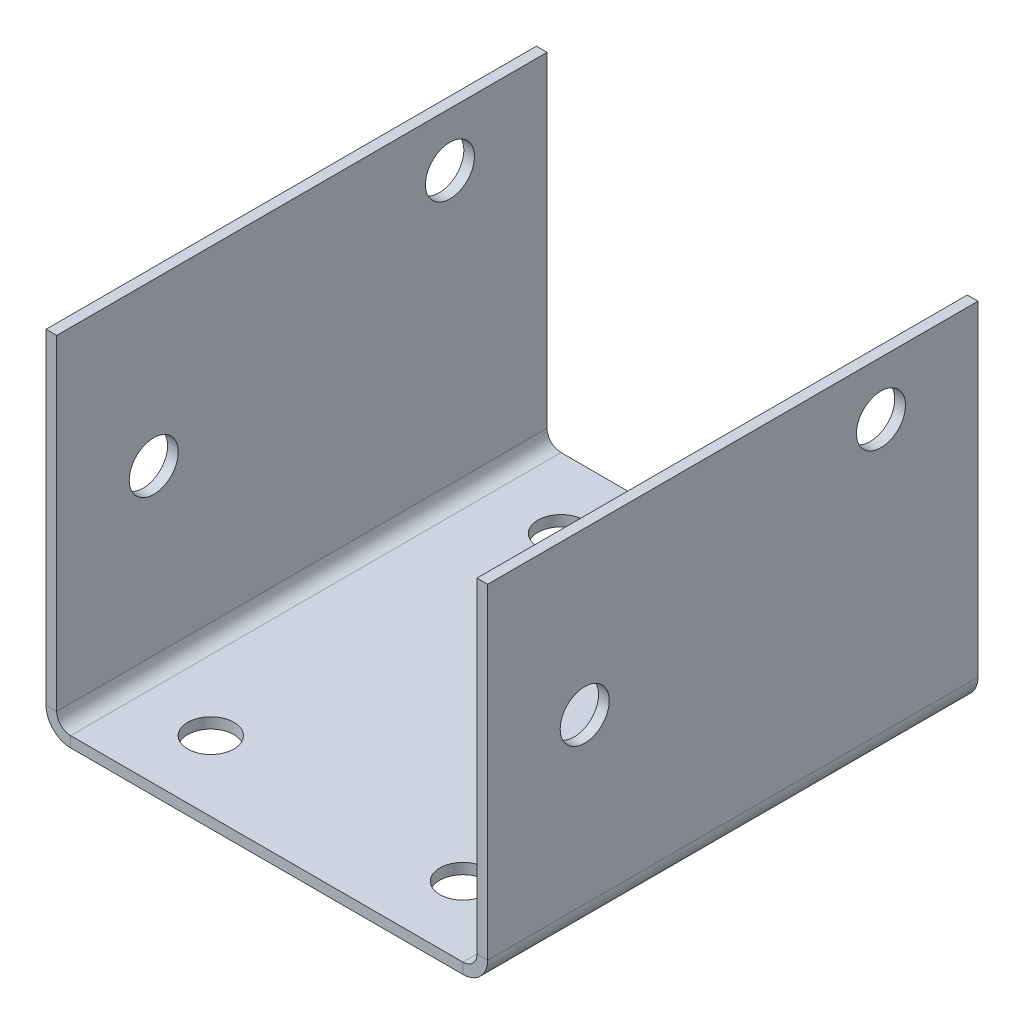
ISO-10303-21;
HEADER;
FILE_DESCRIPTION(('STEP AP214'),'2;1');
FILE_NAME('part.step','',(''),(''),'','','');
FILE_SCHEMA(('AUTOMOTIVE_DESIGN { 1 0 10303 214 1 1 1 1 }'));
ENDSEC;
DATA;
#1=APPLICATION_CONTEXT('core data for automotive mechanical design processes');
#2=APPLICATION_PROTOCOL_DEFINITION('international standard','automotive_design',2000,#1);
#3=PRODUCT_CONTEXT('',#1,'mechanical');
#4=PRODUCT('Part','Part','',(#3));
#5=PRODUCT_RELATED_PRODUCT_CATEGORY('part','',(#4));
#6=PRODUCT_DEFINITION_FORMATION('','',#4);
#7=PRODUCT_DEFINITION_CONTEXT('part definition',#1,'design');
#8=PRODUCT_DEFINITION('design','',#6,#7);
#9=PRODUCT_DEFINITION_SHAPE('','',#8);
#10=(LENGTH_UNIT() NAMED_UNIT(*) SI_UNIT(.MILLI.,.METRE.));
#11=(NAMED_UNIT(*) PLANE_ANGLE_UNIT() SI_UNIT($,.RADIAN.));
#12=(NAMED_UNIT(*) SI_UNIT($,.STERADIAN.) SOLID_ANGLE_UNIT());
#13=UNCERTAINTY_MEASURE_WITH_UNIT(LENGTH_MEASURE(1.E-05),#10,'distance_accuracy_value','');
#14=(GEOMETRIC_REPRESENTATION_CONTEXT(3) GLOBAL_UNCERTAINTY_ASSIGNED_CONTEXT((#13)) GLOBAL_UNIT_ASSIGNED_CONTEXT((#10,
#11,#12)) REPRESENTATION_CONTEXT('',''));
#15=CARTESIAN_POINT('',(0.,0.,0.));
#16=DIRECTION('',(0.,0.,1.));
#17=DIRECTION('',(1.,0.,0.));
#18=AXIS2_PLACEMENT_3D('',#15,#16,#17);
#19=CARTESIAN_POINT('',(0.,-1.524,0.));
#20=DIRECTION('',(0.,-1.,0.));
#21=DIRECTION('',(0.,0.,-1.));
#22=AXIS2_PLACEMENT_3D('',#19,#20,#21);
#23=PLANE('',#22);
#24=CARTESIAN_POINT('',(-18.,-1.524,25.));
#25=DIRECTION('',(0.,1.,0.));
#26=DIRECTION('',(0.,0.,1.));
#27=AXIS2_PLACEMENT_3D('',#24,#25,#26);
#28=CIRCLE('',#27,3.3);
#29=CARTESIAN_POINT('',(-18.,-1.524,28.3));
#30=VERTEX_POINT('',#29);
#31=EDGE_CURVE('E566',#30,#30,#28,.T.);
#32=ORIENTED_EDGE('',*,*,#31,.T.);
#33=EDGE_LOOP('',(#32));
#34=FACE_BOUND('',#33,.T.);
#35=CARTESIAN_POINT('',(18.,-1.524,25.));
#36=DIRECTION('',(0.,1.,0.));
#37=DIRECTION('',(0.,0.,1.));
#38=AXIS2_PLACEMENT_3D('',#35,#36,#37);
#39=CIRCLE('',#38,3.3);
#40=CARTESIAN_POINT('',(18.,-1.524,28.3));
#41=VERTEX_POINT('',#40);
#42=EDGE_CURVE('E576',#41,#41,#39,.T.);
#43=ORIENTED_EDGE('',*,*,#42,.T.);
#44=EDGE_LOOP('',(#43));
#45=FACE_BOUND('',#44,.T.);
#46=CARTESIAN_POINT('',(18.,-1.524,-25.));
#47=DIRECTION('',(0.,1.,0.));
#48=DIRECTION('',(0.,0.,1.));
#49=AXIS2_PLACEMENT_3D('',#46,#47,#48);
#50=CIRCLE('',#49,3.3);
#51=CARTESIAN_POINT('',(18.,-1.524,-21.7));
#52=VERTEX_POINT('',#51);
#53=EDGE_CURVE('E582',#52,#52,#50,.T.);
#54=ORIENTED_EDGE('',*,*,#53,.T.);
#55=EDGE_LOOP('',(#54));
#56=FACE_BOUND('',#55,.T.);
#57=CARTESIAN_POINT('',(-18.,-1.524,-25.));
#58=DIRECTION('',(0.,1.,0.));
#59=DIRECTION('',(0.,0.,1.));
#60=AXIS2_PLACEMENT_3D('',#57,#58,#59);
#61=CIRCLE('',#60,3.3);
#62=CARTESIAN_POINT('',(-18.,-1.524,-21.7));
#63=VERTEX_POINT('',#62);
#64=EDGE_CURVE('E588',#63,#63,#61,.T.);
#65=ORIENTED_EDGE('',*,*,#64,.T.);
#66=EDGE_LOOP('',(#65));
#67=FACE_BOUND('',#66,.T.);
#68=DIRECTION('',(-1.,0.,0.));
#69=VECTOR('',#68,1.);
#70=CARTESIAN_POINT('',(-30.,-1.524,-35.));
#71=LINE('',#70,#69);
#72=CARTESIAN_POINT('',(28.,-1.524,-35.));
#73=VERTEX_POINT('',#72);
#74=CARTESIAN_POINT('',(-28.,-1.524,-35.));
#75=VERTEX_POINT('',#74);
#76=EDGE_CURVE('E52',#73,#75,#71,.T.);
#77=ORIENTED_EDGE('',*,*,#76,.F.);
#78=DIRECTION('',(0.,0.,-1.));
#79=VECTOR('',#78,1.);
#80=CARTESIAN_POINT('',(28.,-1.524,-35.));
#81=LINE('',#80,#79);
#82=CARTESIAN_POINT('',(28.,-1.524,35.));
#83=VERTEX_POINT('',#82);
#84=EDGE_CURVE('E138',#73,#83,#81,.F.);
#85=ORIENTED_EDGE('',*,*,#84,.T.);
#86=DIRECTION('',(1.,0.,0.));
#87=VECTOR('',#86,1.);
#88=CARTESIAN_POINT('',(-30.,-1.524,35.));
#89=LINE('',#88,#87);
#90=CARTESIAN_POINT('',(-28.,-1.52399999999999,35.));
#91=VERTEX_POINT('',#90);
#92=EDGE_CURVE('E11',#91,#83,#89,.T.);
#93=ORIENTED_EDGE('',*,*,#92,.F.);
#94=DIRECTION('',(0.,0.,1.));
#95=VECTOR('',#94,1.);
#96=CARTESIAN_POINT('',(-28.,-1.52399999999999,35.));
#97=LINE('',#96,#95);
#98=EDGE_CURVE('E224',#91,#75,#97,.F.);
#99=ORIENTED_EDGE('',*,*,#98,.T.);
#100=EDGE_LOOP('',(#77,#85,#93,#99));
#101=FACE_BOUND('',#100,.T.);
#102=ADVANCED_FACE('F43',(#34,#45,#56,#67,#101),#23,.T.);
#103=CARTESIAN_POINT('',(0.,0.,0.));
#104=DIRECTION('',(0.,-1.,0.));
#105=DIRECTION('',(0.,0.,-1.));
#106=AXIS2_PLACEMENT_3D('',#103,#104,#105);
#107=PLANE('',#106);
#108=CARTESIAN_POINT('',(-18.,0.,25.));
#109=DIRECTION('',(0.,1.,0.));
#110=DIRECTION('',(0.,0.,1.));
#111=AXIS2_PLACEMENT_3D('',#108,#109,#110);
#112=CIRCLE('',#111,3.3);
#113=CARTESIAN_POINT('',(-18.,0.,28.3));
#114=VERTEX_POINT('',#113);
#115=EDGE_CURVE('E569',#114,#114,#112,.T.);
#116=ORIENTED_EDGE('',*,*,#115,.F.);
#117=EDGE_LOOP('',(#116));
#118=FACE_BOUND('',#117,.T.);
#119=CARTESIAN_POINT('',(18.,0.,25.));
#120=DIRECTION('',(0.,1.,0.));
#121=DIRECTION('',(0.,0.,1.));
#122=AXIS2_PLACEMENT_3D('',#119,#120,#121);
#123=CIRCLE('',#122,3.3);
#124=CARTESIAN_POINT('',(18.,0.,28.3));
#125=VERTEX_POINT('',#124);
#126=EDGE_CURVE('E571',#125,#125,#123,.T.);
#127=ORIENTED_EDGE('',*,*,#126,.F.);
#128=EDGE_LOOP('',(#127));
#129=FACE_BOUND('',#128,.T.);
#130=CARTESIAN_POINT('',(18.,0.,-25.));
#131=DIRECTION('',(0.,1.,0.));
#132=DIRECTION('',(0.,0.,1.));
#133=AXIS2_PLACEMENT_3D('',#130,#131,#132);
#134=CIRCLE('',#133,3.3);
#135=CARTESIAN_POINT('',(18.,0.,-21.7));
#136=VERTEX_POINT('',#135);
#137=EDGE_CURVE('E579',#136,#136,#134,.T.);
#138=ORIENTED_EDGE('',*,*,#137,.F.);
#139=EDGE_LOOP('',(#138));
#140=FACE_BOUND('',#139,.T.);
#141=CARTESIAN_POINT('',(-18.,0.,-25.));
#142=DIRECTION('',(0.,1.,0.));
#143=DIRECTION('',(0.,0.,1.));
#144=AXIS2_PLACEMENT_3D('',#141,#142,#143);
#145=CIRCLE('',#144,3.3);
#146=CARTESIAN_POINT('',(-18.,0.,-21.7));
#147=VERTEX_POINT('',#146);
#148=EDGE_CURVE('E585',#147,#147,#145,.T.);
#149=ORIENTED_EDGE('',*,*,#148,.F.);
#150=EDGE_LOOP('',(#149));
#151=FACE_BOUND('',#150,.T.);
#152=DIRECTION('',(0.,0.,-1.));
#153=VECTOR('',#152,1.);
#154=CARTESIAN_POINT('',(28.,0.,-35.));
#155=LINE('',#154,#153);
#156=CARTESIAN_POINT('',(28.,0.,-35.));
#157=VERTEX_POINT('',#156);
#158=CARTESIAN_POINT('',(28.,0.,35.));
#159=VERTEX_POINT('',#158);
#160=EDGE_CURVE('E187',#157,#159,#155,.F.);
#161=ORIENTED_EDGE('',*,*,#160,.F.);
#162=DIRECTION('',(-1.,0.,0.));
#163=VECTOR('',#162,1.);
#164=CARTESIAN_POINT('',(-30.,0.,-35.));
#165=LINE('',#164,#163);
#166=CARTESIAN_POINT('',(-28.,0.,-35.));
#167=VERTEX_POINT('',#166);
#168=EDGE_CURVE('E241',#157,#167,#165,.T.);
#169=ORIENTED_EDGE('',*,*,#168,.T.);
#170=DIRECTION('',(0.,0.,1.));
#171=VECTOR('',#170,1.);
#172=CARTESIAN_POINT('',(-28.,0.,35.));
#173=LINE('',#172,#171);
#174=CARTESIAN_POINT('',(-28.,0.,35.));
#175=VERTEX_POINT('',#174);
#176=EDGE_CURVE('E235',#175,#167,#173,.F.);
#177=ORIENTED_EDGE('',*,*,#176,.F.);
#178=DIRECTION('',(1.,0.,0.));
#179=VECTOR('',#178,1.);
#180=CARTESIAN_POINT('',(-30.,0.,35.));
#181=LINE('',#180,#179);
#182=EDGE_CURVE('E245',#175,#159,#181,.T.);
#183=ORIENTED_EDGE('',*,*,#182,.T.);
#184=EDGE_LOOP('',(#161,#169,#177,#183));
#185=FACE_BOUND('',#184,.T.);
#186=ADVANCED_FACE('F303',(#118,#129,#140,#151,#185),#107,.F.);
#187=CARTESIAN_POINT('',(-30.,-1.524,-35.));
#188=DIRECTION('',(0.,0.,-1.));
#189=DIRECTION('',(-1.,0.,0.));
#190=AXIS2_PLACEMENT_3D('',#187,#188,#189);
#191=PLANE('',#190);
#192=ORIENTED_EDGE('',*,*,#168,.F.);
#193=DIRECTION('',(0.,-1.,0.));
#194=VECTOR('',#193,1.);
#195=CARTESIAN_POINT('',(28.,0.,-35.));
#196=LINE('',#195,#194);
#197=EDGE_CURVE('E183',#157,#73,#196,.T.);
#198=ORIENTED_EDGE('',*,*,#197,.T.);
#199=ORIENTED_EDGE('',*,*,#76,.T.);
#200=DIRECTION('',(0.,-1.,0.));
#201=VECTOR('',#200,1.);
#202=CARTESIAN_POINT('',(-28.,0.,-35.));
#203=LINE('',#202,#201);
#204=EDGE_CURVE('E239',#167,#75,#203,.T.);
#205=ORIENTED_EDGE('',*,*,#204,.F.);
#206=EDGE_LOOP('',(#192,#198,#199,#205));
#207=FACE_BOUND('',#206,.T.);
#208=ADVANCED_FACE('F45',(#207),#191,.T.);
#209=CARTESIAN_POINT('',(-30.,-1.524,35.));
#210=DIRECTION('',(0.,0.,1.));
#211=DIRECTION('',(1.,0.,0.));
#212=AXIS2_PLACEMENT_3D('',#209,#210,#211);
#213=PLANE('',#212);
#214=DIRECTION('',(0.,-1.,0.));
#215=VECTOR('',#214,1.);
#216=CARTESIAN_POINT('',(28.,0.,35.));
#217=LINE('',#216,#215);
#218=EDGE_CURVE('E190',#159,#83,#217,.T.);
#219=ORIENTED_EDGE('',*,*,#218,.F.);
#220=ORIENTED_EDGE('',*,*,#182,.F.);
#221=DIRECTION('',(0.,-1.,0.));
#222=VECTOR('',#221,1.);
#223=CARTESIAN_POINT('',(-28.,0.,35.));
#224=LINE('',#223,#222);
#225=EDGE_CURVE('E229',#175,#91,#224,.T.);
#226=ORIENTED_EDGE('',*,*,#225,.T.);
#227=ORIENTED_EDGE('',*,*,#92,.T.);
#228=EDGE_LOOP('',(#219,#220,#226,#227));
#229=FACE_BOUND('',#228,.T.);
#230=ADVANCED_FACE('F317',(#229),#213,.T.);
#231=CARTESIAN_POINT('',(-28.,2.,-35.));
#232=DIRECTION('',(0.,0.,-1.));
#233=DIRECTION('',(0.,1.,0.));
#234=AXIS2_PLACEMENT_3D('',#231,#232,#233);
#235=PLANE('',#234);
#236=DIRECTION('',(-1.,0.,0.));
#237=VECTOR('',#236,1.);
#238=CARTESIAN_POINT('',(-30.,1.99999999999999,-35.));
#239=LINE('',#238,#237);
#240=CARTESIAN_POINT('',(-30.,1.99999999999999,-35.));
#241=VERTEX_POINT('',#240);
#242=CARTESIAN_POINT('',(-31.524,1.99999999999999,-35.));
#243=VERTEX_POINT('',#242);
#244=EDGE_CURVE('E192',#241,#243,#239,.T.);
#245=ORIENTED_EDGE('',*,*,#244,.F.);
#246=CARTESIAN_POINT('',(-28.,2.,-35.));
#247=DIRECTION('',(0.,0.,1.));
#248=DIRECTION('',(0.,-1.,0.));
#249=AXIS2_PLACEMENT_3D('',#246,#247,#248);
#250=CIRCLE('',#249,2.);
#251=EDGE_CURVE('E232',#167,#241,#250,.F.);
#252=ORIENTED_EDGE('',*,*,#251,.F.);
#253=ORIENTED_EDGE('',*,*,#204,.T.);
#254=CARTESIAN_POINT('',(-28.,2.,-35.));
#255=DIRECTION('',(0.,0.,1.));
#256=DIRECTION('',(0.,-1.,0.));
#257=AXIS2_PLACEMENT_3D('',#254,#255,#256);
#258=CIRCLE('',#257,3.524);
#259=EDGE_CURVE('E60',#75,#243,#258,.F.);
#260=ORIENTED_EDGE('',*,*,#259,.T.);
#261=EDGE_LOOP('',(#245,#252,#253,#260));
#262=FACE_BOUND('',#261,.T.);
#263=ADVANCED_FACE('F319',(#262),#235,.T.);
#264=CARTESIAN_POINT('',(-28.,2.00000000000001,35.));
#265=DIRECTION('',(0.,0.,-1.));
#266=DIRECTION('',(0.,1.,0.));
#267=AXIS2_PLACEMENT_3D('',#264,#265,#266);
#268=PLANE('',#267);
#269=CARTESIAN_POINT('',(-28.,2.00000000000001,35.));
#270=DIRECTION('',(0.,0.,1.));
#271=DIRECTION('',(0.,-1.,0.));
#272=AXIS2_PLACEMENT_3D('',#269,#270,#271);
#273=CIRCLE('',#272,2.);
#274=CARTESIAN_POINT('',(-30.,2.,35.));
#275=VERTEX_POINT('',#274);
#276=EDGE_CURVE('E223',#275,#175,#273,.T.);
#277=ORIENTED_EDGE('',*,*,#276,.F.);
#278=DIRECTION('',(-1.,0.,0.));
#279=VECTOR('',#278,1.);
#280=CARTESIAN_POINT('',(-30.,2.,35.));
#281=LINE('',#280,#279);
#282=CARTESIAN_POINT('',(-31.524,1.99999999999999,35.));
#283=VERTEX_POINT('',#282);
#284=EDGE_CURVE('E196',#275,#283,#281,.T.);
#285=ORIENTED_EDGE('',*,*,#284,.T.);
#286=CARTESIAN_POINT('',(-28.,2.00000000000001,35.));
#287=DIRECTION('',(0.,0.,1.));
#288=DIRECTION('',(0.,-1.,0.));
#289=AXIS2_PLACEMENT_3D('',#286,#287,#288);
#290=CIRCLE('',#289,3.524);
#291=EDGE_CURVE('E227',#283,#91,#290,.T.);
#292=ORIENTED_EDGE('',*,*,#291,.T.);
#293=ORIENTED_EDGE('',*,*,#225,.F.);
#294=EDGE_LOOP('',(#277,#285,#292,#293));
#295=FACE_BOUND('',#294,.T.);
#296=ADVANCED_FACE('F315',(#295),#268,.F.);
#297=CARTESIAN_POINT('',(-28.,2.00000000000001,35.));
#298=DIRECTION('',(0.,0.,1.));
#299=DIRECTION('',(-1.,0.,0.));
#300=AXIS2_PLACEMENT_3D('',#297,#298,#299);
#301=CYLINDRICAL_SURFACE('',#300,3.524);
#302=ORIENTED_EDGE('',*,*,#98,.F.);
#303=ORIENTED_EDGE('',*,*,#291,.F.);
#304=DIRECTION('',(0.,0.,-1.));
#305=VECTOR('',#304,1.);
#306=CARTESIAN_POINT('',(-31.524,1.99999999999999,0.));
#307=LINE('',#306,#305);
#308=EDGE_CURVE('E199',#283,#243,#307,.T.);
#309=ORIENTED_EDGE('',*,*,#308,.T.);
#310=ORIENTED_EDGE('',*,*,#259,.F.);
#311=EDGE_LOOP('',(#302,#303,#309,#310));
#312=FACE_BOUND('',#311,.T.);
#313=ADVANCED_FACE('F371',(#312),#301,.T.);
#314=CARTESIAN_POINT('',(-28.,2.00000000000001,35.));
#315=DIRECTION('',(0.,0.,1.));
#316=DIRECTION('',(-1.,0.,0.));
#317=AXIS2_PLACEMENT_3D('',#314,#315,#316);
#318=CYLINDRICAL_SURFACE('',#317,2.);
#319=ORIENTED_EDGE('',*,*,#176,.T.);
#320=ORIENTED_EDGE('',*,*,#251,.T.);
#321=DIRECTION('',(0.,0.,1.));
#322=VECTOR('',#321,1.);
#323=CARTESIAN_POINT('',(-30.,1.99999999999999,-35.));
#324=LINE('',#323,#322);
#325=EDGE_CURVE('E194',#241,#275,#324,.T.);
#326=ORIENTED_EDGE('',*,*,#325,.T.);
#327=ORIENTED_EDGE('',*,*,#276,.T.);
#328=EDGE_LOOP('',(#319,#320,#326,#327));
#329=FACE_BOUND('',#328,.T.);
#330=ADVANCED_FACE('F335',(#329),#318,.F.);
#331=CARTESIAN_POINT('',(-31.524,0.,-35.));
#332=DIRECTION('',(0.,0.,1.));
#333=DIRECTION('',(1.,0.,0.));
#334=AXIS2_PLACEMENT_3D('',#331,#332,#333);
#335=PLANE('',#334);
#336=ORIENTED_EDGE('',*,*,#244,.T.);
#337=DIRECTION('',(0.,-1.,0.));
#338=VECTOR('',#337,1.);
#339=CARTESIAN_POINT('',(-31.524,0.,-35.));
#340=LINE('',#339,#338);
#341=CARTESIAN_POINT('',(-31.5240000000002,48.476,-35.));
#342=VERTEX_POINT('',#341);
#343=EDGE_CURVE('E204',#342,#243,#340,.T.);
#344=ORIENTED_EDGE('',*,*,#343,.F.);
#345=DIRECTION('',(1.,0.,0.));
#346=VECTOR('',#345,1.);
#347=CARTESIAN_POINT('',(-31.5240000000002,48.476,-35.));
#348=LINE('',#347,#346);
#349=CARTESIAN_POINT('',(-30.0000000000002,48.476,-35.));
#350=VERTEX_POINT('',#349);
#351=EDGE_CURVE('E212',#342,#350,#348,.T.);
#352=ORIENTED_EDGE('',*,*,#351,.T.);
#353=DIRECTION('',(0.,-1.,0.));
#354=VECTOR('',#353,1.);
#355=CARTESIAN_POINT('',(-30.,0.,-35.));
#356=LINE('',#355,#354);
#357=EDGE_CURVE('E203',#350,#241,#356,.T.);
#358=ORIENTED_EDGE('',*,*,#357,.T.);
#359=EDGE_LOOP('',(#336,#344,#352,#358));
#360=FACE_BOUND('',#359,.T.);
#361=ADVANCED_FACE('F340',(#360),#335,.F.);
#362=CARTESIAN_POINT('',(-31.5240000000002,48.476,35.));
#363=DIRECTION('',(0.,0.,-1.));
#364=DIRECTION('',(-1.,0.,0.));
#365=AXIS2_PLACEMENT_3D('',#362,#363,#364);
#366=PLANE('',#365);
#367=ORIENTED_EDGE('',*,*,#284,.F.);
#368=DIRECTION('',(0.,1.,0.));
#369=VECTOR('',#368,1.);
#370=CARTESIAN_POINT('',(-30.0000000000002,48.476,35.));
#371=LINE('',#370,#369);
#372=CARTESIAN_POINT('',(-30.0000000000002,48.476,35.));
#373=VERTEX_POINT('',#372);
#374=EDGE_CURVE('E215',#275,#373,#371,.T.);
#375=ORIENTED_EDGE('',*,*,#374,.T.);
#376=DIRECTION('',(1.,0.,0.));
#377=VECTOR('',#376,1.);
#378=CARTESIAN_POINT('',(-31.5240000000002,48.476,35.));
#379=LINE('',#378,#377);
#380=CARTESIAN_POINT('',(-31.5240000000002,48.476,35.));
#381=VERTEX_POINT('',#380);
#382=EDGE_CURVE('E220',#381,#373,#379,.T.);
#383=ORIENTED_EDGE('',*,*,#382,.F.);
#384=DIRECTION('',(0.,1.,0.));
#385=VECTOR('',#384,1.);
#386=CARTESIAN_POINT('',(-31.5240000000002,48.476,35.));
#387=LINE('',#386,#385);
#388=EDGE_CURVE('E207',#283,#381,#387,.T.);
#389=ORIENTED_EDGE('',*,*,#388,.F.);
#390=EDGE_LOOP('',(#367,#375,#383,#389));
#391=FACE_BOUND('',#390,.T.);
#392=ADVANCED_FACE('F358',(#391),#366,.F.);
#393=CARTESIAN_POINT('',(-31.524,-1.10529512885337E-13,0.));
#394=DIRECTION('',(1.,0.,0.));
#395=DIRECTION('',(0.,1.,0.));
#396=AXIS2_PLACEMENT_3D('',#393,#394,#395);
#397=PLANE('',#396);
#398=CARTESIAN_POINT('',(-31.5240000000001,25.4,21.143083967683));
#399=DIRECTION('',(-1.,0.,0.));
#400=DIRECTION('',(0.,0.,1.));
#401=AXIS2_PLACEMENT_3D('',#398,#399,#400);
#402=CIRCLE('',#401,3.5);
#403=CARTESIAN_POINT('',(-31.5240000000001,25.4,24.643083967683));
#404=VERTEX_POINT('',#403);
#405=EDGE_CURVE('E591',#404,#404,#402,.T.);
#406=ORIENTED_EDGE('',*,*,#405,.F.);
#407=EDGE_LOOP('',(#406));
#408=FACE_BOUND('',#407,.T.);
#409=CARTESIAN_POINT('',(-31.5240000000001,40.7909064496548,-21.143083967683));
#410=DIRECTION('',(-1.,0.,0.));
#411=DIRECTION('',(0.,0.,1.));
#412=AXIS2_PLACEMENT_3D('',#409,#410,#411);
#413=CIRCLE('',#412,3.5);
#414=CARTESIAN_POINT('',(-31.5240000000001,40.7909064496548,-17.643083967683));
#415=VERTEX_POINT('',#414);
#416=EDGE_CURVE('E260',#415,#415,#413,.T.);
#417=ORIENTED_EDGE('',*,*,#416,.F.);
#418=EDGE_LOOP('',(#417));
#419=FACE_BOUND('',#418,.T.);
#420=ORIENTED_EDGE('',*,*,#308,.F.);
#421=ORIENTED_EDGE('',*,*,#388,.T.);
#422=DIRECTION('',(0.,0.,-1.));
#423=VECTOR('',#422,1.);
#424=CARTESIAN_POINT('',(-31.5240000000002,48.476,-35.));
#425=LINE('',#424,#423);
#426=EDGE_CURVE('E210',#381,#342,#425,.T.);
#427=ORIENTED_EDGE('',*,*,#426,.T.);
#428=ORIENTED_EDGE('',*,*,#343,.T.);
#429=EDGE_LOOP('',(#420,#421,#427,#428));
#430=FACE_BOUND('',#429,.T.);
#431=ADVANCED_FACE('F344',(#408,#419,#430),#397,.F.);
#432=CARTESIAN_POINT('',(-30.,-1.0520849532494E-13,0.));
#433=DIRECTION('',(1.,0.,0.));
#434=DIRECTION('',(0.,1.,0.));
#435=AXIS2_PLACEMENT_3D('',#432,#433,#434);
#436=PLANE('',#435);
#437=CARTESIAN_POINT('',(-30.0000000000001,25.4,21.143083967683));
#438=DIRECTION('',(1.,0.,0.));
#439=DIRECTION('',(0.,1.,0.));
#440=AXIS2_PLACEMENT_3D('',#437,#438,#439);
#441=CIRCLE('',#440,3.5);
#442=CARTESIAN_POINT('',(-30.0000000000001,28.9,21.143083967683));
#443=VERTEX_POINT('',#442);
#444=EDGE_CURVE('E265',#443,#443,#441,.T.);
#445=ORIENTED_EDGE('',*,*,#444,.F.);
#446=EDGE_LOOP('',(#445));
#447=FACE_BOUND('',#446,.T.);
#448=CARTESIAN_POINT('',(-30.0000000000001,40.7909064496548,-21.143083967683));
#449=DIRECTION('',(1.,0.,0.));
#450=DIRECTION('',(0.,1.,0.));
#451=AXIS2_PLACEMENT_3D('',#448,#449,#450);
#452=CIRCLE('',#451,3.5);
#453=CARTESIAN_POINT('',(-30.0000000000002,44.2909064496548,-21.143083967683));
#454=VERTEX_POINT('',#453);
#455=EDGE_CURVE('E252',#454,#454,#452,.T.);
#456=ORIENTED_EDGE('',*,*,#455,.F.);
#457=EDGE_LOOP('',(#456));
#458=FACE_BOUND('',#457,.T.);
#459=ORIENTED_EDGE('',*,*,#374,.F.);
#460=ORIENTED_EDGE('',*,*,#325,.F.);
#461=ORIENTED_EDGE('',*,*,#357,.F.);
#462=DIRECTION('',(0.,0.,-1.));
#463=VECTOR('',#462,1.);
#464=CARTESIAN_POINT('',(-30.0000000000002,48.476,-35.));
#465=LINE('',#464,#463);
#466=EDGE_CURVE('E208',#373,#350,#465,.T.);
#467=ORIENTED_EDGE('',*,*,#466,.F.);
#468=EDGE_LOOP('',(#459,#460,#461,#467));
#469=FACE_BOUND('',#468,.T.);
#470=ADVANCED_FACE('F354',(#447,#458,#469),#436,.T.);
#471=CARTESIAN_POINT('',(-31.5240000000002,48.476,-35.));
#472=DIRECTION('',(0.,-1.,0.));
#473=DIRECTION('',(1.,0.,0.));
#474=AXIS2_PLACEMENT_3D('',#471,#472,#473);
#475=PLANE('',#474);
#476=ORIENTED_EDGE('',*,*,#466,.T.);
#477=ORIENTED_EDGE('',*,*,#351,.F.);
#478=ORIENTED_EDGE('',*,*,#426,.F.);
#479=ORIENTED_EDGE('',*,*,#382,.T.);
#480=EDGE_LOOP('',(#476,#477,#478,#479));
#481=FACE_BOUND('',#480,.T.);
#482=ADVANCED_FACE('F350',(#481),#475,.F.);
#483=CARTESIAN_POINT('',(28.,2.,35.));
#484=DIRECTION('',(0.,0.,1.));
#485=DIRECTION('',(1.,0.,0.));
#486=AXIS2_PLACEMENT_3D('',#483,#484,#485);
#487=PLANE('',#486);
#488=DIRECTION('',(1.,0.,0.));
#489=VECTOR('',#488,1.);
#490=CARTESIAN_POINT('',(30.,1.99999999999999,35.));
#491=LINE('',#490,#489);
#492=CARTESIAN_POINT('',(30.,1.99999999999999,35.));
#493=VERTEX_POINT('',#492);
#494=CARTESIAN_POINT('',(31.524,1.99999999999999,35.));
#495=VERTEX_POINT('',#494);
#496=EDGE_CURVE('E257',#493,#495,#491,.T.);
#497=ORIENTED_EDGE('',*,*,#496,.F.);
#498=CARTESIAN_POINT('',(28.,2.,35.));
#499=DIRECTION('',(0.,0.,-1.));
#500=DIRECTION('',(-1.,0.,0.));
#501=AXIS2_PLACEMENT_3D('',#498,#499,#500);
#502=CIRCLE('',#501,2.);
#503=EDGE_CURVE('E141',#159,#493,#502,.F.);
#504=ORIENTED_EDGE('',*,*,#503,.F.);
#505=ORIENTED_EDGE('',*,*,#218,.T.);
#506=CARTESIAN_POINT('',(28.,2.,35.));
#507=DIRECTION('',(0.,0.,-1.));
#508=DIRECTION('',(-1.,0.,0.));
#509=AXIS2_PLACEMENT_3D('',#506,#507,#508);
#510=CIRCLE('',#509,3.524);
#511=EDGE_CURVE('E68',#83,#495,#510,.F.);
#512=ORIENTED_EDGE('',*,*,#511,.T.);
#513=EDGE_LOOP('',(#497,#504,#505,#512));
#514=FACE_BOUND('',#513,.T.);
#515=ADVANCED_FACE('F276',(#514),#487,.T.);
#516=CARTESIAN_POINT('',(28.,2.,-35.));
#517=DIRECTION('',(0.,0.,1.));
#518=DIRECTION('',(1.,0.,0.));
#519=AXIS2_PLACEMENT_3D('',#516,#517,#518);
#520=PLANE('',#519);
#521=CARTESIAN_POINT('',(28.,2.,-35.));
#522=DIRECTION('',(0.,0.,-1.));
#523=DIRECTION('',(-1.,0.,0.));
#524=AXIS2_PLACEMENT_3D('',#521,#522,#523);
#525=CIRCLE('',#524,2.);
#526=CARTESIAN_POINT('',(30.,1.99999999999999,-35.));
#527=VERTEX_POINT('',#526);
#528=EDGE_CURVE('E148',#527,#157,#525,.T.);
#529=ORIENTED_EDGE('',*,*,#528,.F.);
#530=DIRECTION('',(1.,0.,0.));
#531=VECTOR('',#530,1.);
#532=CARTESIAN_POINT('',(30.,1.99999999999999,-35.));
#533=LINE('',#532,#531);
#534=CARTESIAN_POINT('',(31.524,1.99999999999999,-35.));
#535=VERTEX_POINT('',#534);
#536=EDGE_CURVE('E145',#527,#535,#533,.T.);
#537=ORIENTED_EDGE('',*,*,#536,.T.);
#538=CARTESIAN_POINT('',(28.,2.,-35.));
#539=DIRECTION('',(0.,0.,-1.));
#540=DIRECTION('',(-1.,0.,0.));
#541=AXIS2_PLACEMENT_3D('',#538,#539,#540);
#542=CIRCLE('',#541,3.524);
#543=EDGE_CURVE('E132',#535,#73,#542,.T.);
#544=ORIENTED_EDGE('',*,*,#543,.T.);
#545=ORIENTED_EDGE('',*,*,#197,.F.);
#546=EDGE_LOOP('',(#529,#537,#544,#545));
#547=FACE_BOUND('',#546,.T.);
#548=ADVANCED_FACE('F146',(#547),#520,.F.);
#549=CARTESIAN_POINT('',(28.,2.,-35.));
#550=DIRECTION('',(0.,0.,-1.));
#551=DIRECTION('',(1.,0.,0.));
#552=AXIS2_PLACEMENT_3D('',#549,#550,#551);
#553=CYLINDRICAL_SURFACE('',#552,3.524);
#554=ORIENTED_EDGE('',*,*,#84,.F.);
#555=ORIENTED_EDGE('',*,*,#543,.F.);
#556=DIRECTION('',(0.,0.,1.));
#557=VECTOR('',#556,1.);
#558=CARTESIAN_POINT('',(31.524,1.99999999999999,0.));
#559=LINE('',#558,#557);
#560=EDGE_CURVE('E136',#535,#495,#559,.T.);
#561=ORIENTED_EDGE('',*,*,#560,.T.);
#562=ORIENTED_EDGE('',*,*,#511,.F.);
#563=EDGE_LOOP('',(#554,#555,#561,#562));
#564=FACE_BOUND('',#563,.T.);
#565=ADVANCED_FACE('F134',(#564),#553,.T.);
#566=CARTESIAN_POINT('',(28.,2.,-35.));
#567=DIRECTION('',(0.,0.,-1.));
#568=DIRECTION('',(1.,0.,0.));
#569=AXIS2_PLACEMENT_3D('',#566,#567,#568);
#570=CYLINDRICAL_SURFACE('',#569,2.);
#571=ORIENTED_EDGE('',*,*,#160,.T.);
#572=ORIENTED_EDGE('',*,*,#503,.T.);
#573=DIRECTION('',(0.,0.,-1.));
#574=VECTOR('',#573,1.);
#575=CARTESIAN_POINT('',(30.,1.99999999999999,35.));
#576=LINE('',#575,#574);
#577=EDGE_CURVE('E152',#493,#527,#576,.T.);
#578=ORIENTED_EDGE('',*,*,#577,.T.);
#579=ORIENTED_EDGE('',*,*,#528,.T.);
#580=EDGE_LOOP('',(#571,#572,#578,#579));
#581=FACE_BOUND('',#580,.T.);
#582=ADVANCED_FACE('F280',(#581),#570,.F.);
#583=CARTESIAN_POINT('',(31.524,0.,35.));
#584=DIRECTION('',(0.,0.,-1.));
#585=DIRECTION('',(-1.,0.,0.));
#586=AXIS2_PLACEMENT_3D('',#583,#584,#585);
#587=PLANE('',#586);
#588=ORIENTED_EDGE('',*,*,#496,.T.);
#589=DIRECTION('',(0.,-1.,0.));
#590=VECTOR('',#589,1.);
#591=CARTESIAN_POINT('',(31.524,0.,35.));
#592=LINE('',#591,#590);
#593=CARTESIAN_POINT('',(31.5240000000002,48.476,35.));
#594=VERTEX_POINT('',#593);
#595=EDGE_CURVE('E160',#594,#495,#592,.T.);
#596=ORIENTED_EDGE('',*,*,#595,.F.);
#597=DIRECTION('',(-1.,0.,0.));
#598=VECTOR('',#597,1.);
#599=CARTESIAN_POINT('',(31.5240000000002,48.476,35.));
#600=LINE('',#599,#598);
#601=CARTESIAN_POINT('',(30.0000000000002,48.476,35.));
#602=VERTEX_POINT('',#601);
#603=EDGE_CURVE('E169',#594,#602,#600,.T.);
#604=ORIENTED_EDGE('',*,*,#603,.T.);
#605=DIRECTION('',(0.,-1.,0.));
#606=VECTOR('',#605,1.);
#607=CARTESIAN_POINT('',(30.,0.,35.));
#608=LINE('',#607,#606);
#609=EDGE_CURVE('E161',#602,#493,#608,.T.);
#610=ORIENTED_EDGE('',*,*,#609,.T.);
#611=EDGE_LOOP('',(#588,#596,#604,#610));
#612=FACE_BOUND('',#611,.T.);
#613=ADVANCED_FACE('F272',(#612),#587,.F.);
#614=CARTESIAN_POINT('',(31.5240000000002,48.476,-35.));
#615=DIRECTION('',(0.,0.,1.));
#616=DIRECTION('',(1.,0.,0.));
#617=AXIS2_PLACEMENT_3D('',#614,#615,#616);
#618=PLANE('',#617);
#619=ORIENTED_EDGE('',*,*,#536,.F.);
#620=DIRECTION('',(0.,1.,0.));
#621=VECTOR('',#620,1.);
#622=CARTESIAN_POINT('',(30.0000000000002,48.476,-35.));
#623=LINE('',#622,#621);
#624=CARTESIAN_POINT('',(30.0000000000002,48.476,-35.));
#625=VERTEX_POINT('',#624);
#626=EDGE_CURVE('E176',#527,#625,#623,.T.);
#627=ORIENTED_EDGE('',*,*,#626,.T.);
#628=DIRECTION('',(-1.,0.,0.));
#629=VECTOR('',#628,1.);
#630=CARTESIAN_POINT('',(31.5240000000002,48.476,-35.));
#631=LINE('',#630,#629);
#632=CARTESIAN_POINT('',(31.5240000000002,48.476,-35.));
#633=VERTEX_POINT('',#632);
#634=EDGE_CURVE('E165',#633,#625,#631,.T.);
#635=ORIENTED_EDGE('',*,*,#634,.F.);
#636=DIRECTION('',(0.,1.,0.));
#637=VECTOR('',#636,1.);
#638=CARTESIAN_POINT('',(31.5240000000002,48.476,-35.));
#639=LINE('',#638,#637);
#640=EDGE_CURVE('E157',#535,#633,#639,.T.);
#641=ORIENTED_EDGE('',*,*,#640,.F.);
#642=EDGE_LOOP('',(#619,#627,#635,#641));
#643=FACE_BOUND('',#642,.T.);
#644=ADVANCED_FACE('F163',(#643),#618,.F.);
#645=CARTESIAN_POINT('',(31.524,-1.10529512885337E-13,0.));
#646=DIRECTION('',(-1.,0.,0.));
#647=DIRECTION('',(0.,-1.,0.));
#648=AXIS2_PLACEMENT_3D('',#645,#646,#647);
#649=PLANE('',#648);
#650=CARTESIAN_POINT('',(31.5240000000003,25.4,21.143083967683));
#651=DIRECTION('',(-1.,0.,0.));
#652=DIRECTION('',(0.,0.,1.));
#653=AXIS2_PLACEMENT_3D('',#650,#651,#652);
#654=CIRCLE('',#653,3.49999999999999);
#655=CARTESIAN_POINT('',(31.5240000000003,25.4,24.643083967683));
#656=VERTEX_POINT('',#655);
#657=EDGE_CURVE('E594',#656,#656,#654,.T.);
#658=ORIENTED_EDGE('',*,*,#657,.T.);
#659=EDGE_LOOP('',(#658));
#660=FACE_BOUND('',#659,.T.);
#661=CARTESIAN_POINT('',(31.5240000000002,40.7909064496548,-21.143083967683));
#662=DIRECTION('',(-1.,0.,0.));
#663=DIRECTION('',(0.,0.,1.));
#664=AXIS2_PLACEMENT_3D('',#661,#662,#663);
#665=CIRCLE('',#664,3.49999999999999);
#666=CARTESIAN_POINT('',(31.5240000000002,40.7909064496548,-17.643083967683));
#667=VERTEX_POINT('',#666);
#668=EDGE_CURVE('E253',#667,#667,#665,.T.);
#669=ORIENTED_EDGE('',*,*,#668,.T.);
#670=EDGE_LOOP('',(#669));
#671=FACE_BOUND('',#670,.T.);
#672=ORIENTED_EDGE('',*,*,#560,.F.);
#673=ORIENTED_EDGE('',*,*,#640,.T.);
#674=DIRECTION('',(0.,0.,1.));
#675=VECTOR('',#674,1.);
#676=CARTESIAN_POINT('',(31.5240000000002,48.476,35.));
#677=LINE('',#676,#675);
#678=EDGE_CURVE('E167',#633,#594,#677,.T.);
#679=ORIENTED_EDGE('',*,*,#678,.T.);
#680=ORIENTED_EDGE('',*,*,#595,.T.);
#681=EDGE_LOOP('',(#672,#673,#679,#680));
#682=FACE_BOUND('',#681,.T.);
#683=ADVANCED_FACE('F156',(#660,#671,#682),#649,.F.);
#684=CARTESIAN_POINT('',(30.,-1.0520849532494E-13,0.));
#685=DIRECTION('',(-1.,0.,0.));
#686=DIRECTION('',(0.,-1.,0.));
#687=AXIS2_PLACEMENT_3D('',#684,#685,#686);
#688=PLANE('',#687);
#689=CARTESIAN_POINT('',(30.0000000000001,25.4,21.143083967683));
#690=DIRECTION('',(-1.,0.,0.));
#691=DIRECTION('',(0.,-1.,0.));
#692=AXIS2_PLACEMENT_3D('',#689,#690,#691);
#693=CIRCLE('',#692,3.5);
#694=CARTESIAN_POINT('',(30.0000000000001,21.9,21.143083967683));
#695=VERTEX_POINT('',#694);
#696=EDGE_CURVE('E47',#695,#695,#693,.T.);
#697=ORIENTED_EDGE('',*,*,#696,.F.);
#698=EDGE_LOOP('',(#697));
#699=FACE_BOUND('',#698,.T.);
#700=CARTESIAN_POINT('',(30.0000000000002,40.7909064496548,-21.143083967683));
#701=DIRECTION('',(-1.,0.,0.));
#702=DIRECTION('',(0.,-1.,0.));
#703=AXIS2_PLACEMENT_3D('',#700,#701,#702);
#704=CIRCLE('',#703,3.5);
#705=CARTESIAN_POINT('',(30.0000000000001,37.2909064496548,-21.143083967683));
#706=VERTEX_POINT('',#705);
#707=EDGE_CURVE('E250',#706,#706,#704,.T.);
#708=ORIENTED_EDGE('',*,*,#707,.F.);
#709=EDGE_LOOP('',(#708));
#710=FACE_BOUND('',#709,.T.);
#711=ORIENTED_EDGE('',*,*,#626,.F.);
#712=ORIENTED_EDGE('',*,*,#577,.F.);
#713=ORIENTED_EDGE('',*,*,#609,.F.);
#714=DIRECTION('',(0.,0.,1.));
#715=VECTOR('',#714,1.);
#716=CARTESIAN_POINT('',(30.0000000000002,48.476,35.));
#717=LINE('',#716,#715);
#718=EDGE_CURVE('E171',#625,#602,#717,.T.);
#719=ORIENTED_EDGE('',*,*,#718,.F.);
#720=EDGE_LOOP('',(#711,#712,#713,#719));
#721=FACE_BOUND('',#720,.T.);
#722=ADVANCED_FACE('F283',(#699,#710,#721),#688,.T.);
#723=CARTESIAN_POINT('',(31.5240000000002,48.476,35.));
#724=DIRECTION('',(0.,-1.,0.));
#725=DIRECTION('',(1.,0.,0.));
#726=AXIS2_PLACEMENT_3D('',#723,#724,#725);
#727=PLANE('',#726);
#728=ORIENTED_EDGE('',*,*,#718,.T.);
#729=ORIENTED_EDGE('',*,*,#603,.F.);
#730=ORIENTED_EDGE('',*,*,#678,.F.);
#731=ORIENTED_EDGE('',*,*,#634,.T.);
#732=EDGE_LOOP('',(#728,#729,#730,#731));
#733=FACE_BOUND('',#732,.T.);
#734=ADVANCED_FACE('F286',(#733),#727,.F.);
#735=CARTESIAN_POINT('',(-31.5240000000001,40.7909064496548,-21.143083967683));
#736=DIRECTION('',(-1.,0.,0.));
#737=DIRECTION('',(0.,0.,1.));
#738=AXIS2_PLACEMENT_3D('',#735,#736,#737);
#739=CYLINDRICAL_SURFACE('',#738,3.5);
#740=ORIENTED_EDGE('',*,*,#707,.T.);
#741=EDGE_LOOP('',(#740));
#742=FACE_BOUND('',#741,.T.);
#743=ORIENTED_EDGE('',*,*,#668,.F.);
#744=EDGE_LOOP('',(#743));
#745=FACE_BOUND('',#744,.T.);
#746=ADVANCED_FACE('F289',(#742,#745),#739,.F.);
#747=ORIENTED_EDGE('',*,*,#455,.T.);
#748=EDGE_LOOP('',(#747));
#749=FACE_BOUND('',#748,.T.);
#750=ORIENTED_EDGE('',*,*,#416,.T.);
#751=EDGE_LOOP('',(#750));
#752=FACE_BOUND('',#751,.T.);
#753=ADVANCED_FACE('F296',(#749,#752),#739,.F.);
#754=CARTESIAN_POINT('',(-31.5240000000001,25.4,21.143083967683));
#755=DIRECTION('',(-1.,0.,0.));
#756=DIRECTION('',(0.,0.,1.));
#757=AXIS2_PLACEMENT_3D('',#754,#755,#756);
#758=CYLINDRICAL_SURFACE('',#757,3.5);
#759=ORIENTED_EDGE('',*,*,#696,.T.);
#760=EDGE_LOOP('',(#759));
#761=FACE_BOUND('',#760,.T.);
#762=ORIENTED_EDGE('',*,*,#657,.F.);
#763=EDGE_LOOP('',(#762));
#764=FACE_BOUND('',#763,.T.);
#765=ADVANCED_FACE('F504',(#761,#764),#758,.F.);
#766=ORIENTED_EDGE('',*,*,#444,.T.);
#767=EDGE_LOOP('',(#766));
#768=FACE_BOUND('',#767,.T.);
#769=ORIENTED_EDGE('',*,*,#405,.T.);
#770=EDGE_LOOP('',(#769));
#771=FACE_BOUND('',#770,.T.);
#772=ADVANCED_FACE('F513',(#768,#771),#758,.F.);
#773=CARTESIAN_POINT('',(-18.,0.,-25.));
#774=DIRECTION('',(0.,1.,0.));
#775=DIRECTION('',(0.,0.,1.));
#776=AXIS2_PLACEMENT_3D('',#773,#774,#775);
#777=CYLINDRICAL_SURFACE('',#776,3.3);
#778=ORIENTED_EDGE('',*,*,#64,.F.);
#779=EDGE_LOOP('',(#778));
#780=FACE_BOUND('',#779,.T.);
#781=ORIENTED_EDGE('',*,*,#148,.T.);
#782=EDGE_LOOP('',(#781));
#783=FACE_BOUND('',#782,.T.);
#784=ADVANCED_FACE('F522',(#780,#783),#777,.F.);
#785=CARTESIAN_POINT('',(18.,0.,-25.));
#786=DIRECTION('',(0.,1.,0.));
#787=DIRECTION('',(0.,0.,1.));
#788=AXIS2_PLACEMENT_3D('',#785,#786,#787);
#789=CYLINDRICAL_SURFACE('',#788,3.3);
#790=ORIENTED_EDGE('',*,*,#53,.F.);
#791=EDGE_LOOP('',(#790));
#792=FACE_BOUND('',#791,.T.);
#793=ORIENTED_EDGE('',*,*,#137,.T.);
#794=EDGE_LOOP('',(#793));
#795=FACE_BOUND('',#794,.T.);
#796=ADVANCED_FACE('F531',(#792,#795),#789,.F.);
#797=CARTESIAN_POINT('',(18.,0.,25.));
#798=DIRECTION('',(0.,1.,0.));
#799=DIRECTION('',(0.,0.,1.));
#800=AXIS2_PLACEMENT_3D('',#797,#798,#799);
#801=CYLINDRICAL_SURFACE('',#800,3.3);
#802=ORIENTED_EDGE('',*,*,#42,.F.);
#803=EDGE_LOOP('',(#802));
#804=FACE_BOUND('',#803,.T.);
#805=ORIENTED_EDGE('',*,*,#126,.T.);
#806=EDGE_LOOP('',(#805));
#807=FACE_BOUND('',#806,.T.);
#808=ADVANCED_FACE('F541',(#804,#807),#801,.F.);
#809=CARTESIAN_POINT('',(-18.,0.,25.));
#810=DIRECTION('',(0.,1.,0.));
#811=DIRECTION('',(0.,0.,1.));
#812=AXIS2_PLACEMENT_3D('',#809,#810,#811);
#813=CYLINDRICAL_SURFACE('',#812,3.3);
#814=ORIENTED_EDGE('',*,*,#31,.F.);
#815=EDGE_LOOP('',(#814));
#816=FACE_BOUND('',#815,.T.);
#817=ORIENTED_EDGE('',*,*,#115,.T.);
#818=EDGE_LOOP('',(#817));
#819=FACE_BOUND('',#818,.T.);
#820=ADVANCED_FACE('F551',(#816,#819),#813,.F.);
#821=CLOSED_SHELL('',(#102,#186,#208,#230,#263,#296,#313,#330,#361,#392,#431,#470,#482,#515,
#548,#565,#582,#613,#644,#683,#722,#734,#746,#753,#765,#772,#784,#796,#808,#820));
#822=MANIFOLD_SOLID_BREP('B2',#821);
#823=ADVANCED_BREP_SHAPE_REPRESENTATION('',(#18,#822),#14);
#824=SHAPE_DEFINITION_REPRESENTATION(#9,#823);
ENDSEC;
END-ISO-10303-21;
